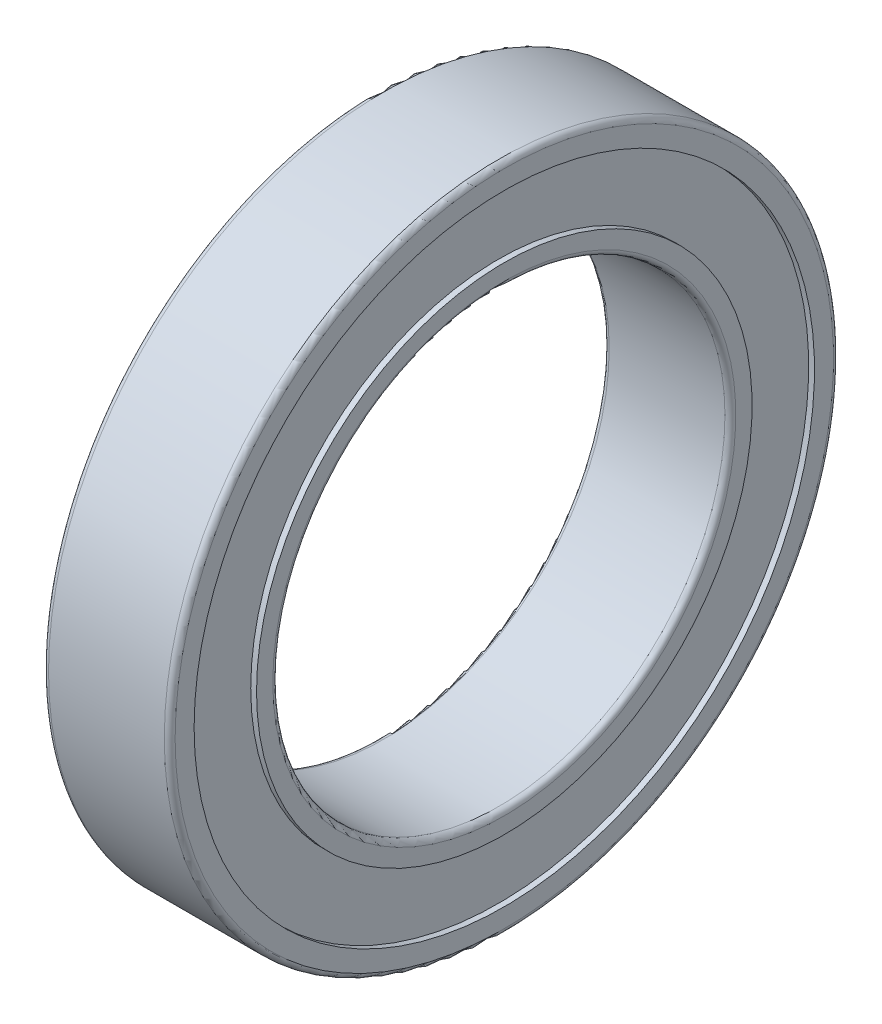
ISO-10303-21;
HEADER;
FILE_DESCRIPTION(('STEP AP214'),'2;1');
FILE_NAME('part.step','',(''),(''),'','','');
FILE_SCHEMA(('AUTOMOTIVE_DESIGN { 1 0 10303 214 1 1 1 1 }'));
ENDSEC;
DATA;
#1=APPLICATION_CONTEXT('core data for automotive mechanical design processes');
#2=APPLICATION_PROTOCOL_DEFINITION('international standard','automotive_design',2000,#1);
#3=PRODUCT_CONTEXT('',#1,'mechanical');
#4=PRODUCT('Part','Part','',(#3));
#5=PRODUCT_RELATED_PRODUCT_CATEGORY('part','',(#4));
#6=PRODUCT_DEFINITION_FORMATION('','',#4);
#7=PRODUCT_DEFINITION_CONTEXT('part definition',#1,'design');
#8=PRODUCT_DEFINITION('design','',#6,#7);
#9=PRODUCT_DEFINITION_SHAPE('','',#8);
#10=(LENGTH_UNIT() NAMED_UNIT(*) SI_UNIT(.MILLI.,.METRE.));
#11=(NAMED_UNIT(*) PLANE_ANGLE_UNIT() SI_UNIT($,.RADIAN.));
#12=(NAMED_UNIT(*) SI_UNIT($,.STERADIAN.) SOLID_ANGLE_UNIT());
#13=UNCERTAINTY_MEASURE_WITH_UNIT(LENGTH_MEASURE(1.E-05),#10,'distance_accuracy_value','');
#14=(GEOMETRIC_REPRESENTATION_CONTEXT(3) GLOBAL_UNCERTAINTY_ASSIGNED_CONTEXT((#13)) GLOBAL_UNIT_ASSIGNED_CONTEXT((#10,
#11,#12)) REPRESENTATION_CONTEXT('',''));
#15=CARTESIAN_POINT('',(0.,0.,0.));
#16=DIRECTION('',(0.,0.,1.));
#17=DIRECTION('',(1.,0.,0.));
#18=AXIS2_PLACEMENT_3D('',#15,#16,#17);
#19=CARTESIAN_POINT('',(0.,18.5,0.));
#20=DIRECTION('',(1.,0.,0.));
#21=DIRECTION('',(0.,0.,-1.));
#22=AXIS2_PLACEMENT_3D('',#19,#20,#21);
#23=PLANE('',#22);
#24=CARTESIAN_POINT('',(0.,0.,0.));
#25=DIRECTION('',(1.,0.,0.));
#26=DIRECTION('',(0.,0.,-1.));
#27=AXIS2_PLACEMENT_3D('',#24,#25,#26);
#28=CIRCLE('',#27,18.2);
#29=CARTESIAN_POINT('',(0.,0.,-18.2));
#30=VERTEX_POINT('',#29);
#31=EDGE_CURVE('E56',#30,#30,#28,.F.);
#32=ORIENTED_EDGE('',*,*,#31,.T.);
#33=EDGE_LOOP('',(#32));
#34=FACE_BOUND('',#33,.T.);
#35=CARTESIAN_POINT('',(0.,0.,0.));
#36=DIRECTION('',(-1.,0.,0.));
#37=DIRECTION('',(0.,0.,1.));
#38=AXIS2_PLACEMENT_3D('',#35,#36,#37);
#39=CIRCLE('',#38,17.15);
#40=CARTESIAN_POINT('',(0.,0.,17.15));
#41=VERTEX_POINT('',#40);
#42=EDGE_CURVE('E68',#41,#41,#39,.T.);
#43=ORIENTED_EDGE('',*,*,#42,.F.);
#44=EDGE_LOOP('',(#43));
#45=FACE_BOUND('',#44,.T.);
#46=ADVANCED_FACE('F36',(#34,#45),#23,.F.);
#47=CARTESIAN_POINT('',(0.,0.,0.));
#48=DIRECTION('',(-1.,0.,0.));
#49=DIRECTION('',(0.,0.,1.));
#50=AXIS2_PLACEMENT_3D('',#47,#48,#49);
#51=CYLINDRICAL_SURFACE('',#50,17.15);
#52=CARTESIAN_POINT('',(0.319999999999999,0.,0.));
#53=DIRECTION('',(-1.,0.,0.));
#54=DIRECTION('',(0.,0.,1.));
#55=AXIS2_PLACEMENT_3D('',#52,#53,#54);
#56=CIRCLE('',#55,17.15);
#57=CARTESIAN_POINT('',(0.319999999999999,0.,17.15));
#58=VERTEX_POINT('',#57);
#59=EDGE_CURVE('E71',#58,#58,#56,.T.);
#60=ORIENTED_EDGE('',*,*,#59,.F.);
#61=EDGE_LOOP('',(#60));
#62=FACE_BOUND('',#61,.T.);
#63=ORIENTED_EDGE('',*,*,#42,.T.);
#64=EDGE_LOOP('',(#63));
#65=FACE_BOUND('',#64,.T.);
#66=ADVANCED_FACE('F124',(#62,#65),#51,.F.);
#67=CARTESIAN_POINT('',(0.319999999999999,17.15,0.));
#68=DIRECTION('',(1.,0.,0.));
#69=DIRECTION('',(0.,0.,-1.));
#70=AXIS2_PLACEMENT_3D('',#67,#68,#69);
#71=PLANE('',#70);
#72=CARTESIAN_POINT('',(0.319999999999999,0.,0.));
#73=DIRECTION('',(-1.,0.,0.));
#74=DIRECTION('',(0.,0.,1.));
#75=AXIS2_PLACEMENT_3D('',#72,#73,#74);
#76=CIRCLE('',#75,13.7);
#77=CARTESIAN_POINT('',(0.319999999999999,0.,13.7));
#78=VERTEX_POINT('',#77);
#79=EDGE_CURVE('E74',#78,#78,#76,.T.);
#80=ORIENTED_EDGE('',*,*,#79,.F.);
#81=EDGE_LOOP('',(#80));
#82=FACE_BOUND('',#81,.T.);
#83=ORIENTED_EDGE('',*,*,#59,.T.);
#84=EDGE_LOOP('',(#83));
#85=FACE_BOUND('',#84,.T.);
#86=ADVANCED_FACE('F130',(#82,#85),#71,.F.);
#87=CARTESIAN_POINT('',(0.,0.,0.));
#88=DIRECTION('',(-1.,0.,0.));
#89=DIRECTION('',(0.,0.,1.));
#90=AXIS2_PLACEMENT_3D('',#87,#88,#89);
#91=CYLINDRICAL_SURFACE('',#90,13.7);
#92=CARTESIAN_POINT('',(0.,0.,0.));
#93=DIRECTION('',(-1.,0.,0.));
#94=DIRECTION('',(0.,0.,1.));
#95=AXIS2_PLACEMENT_3D('',#92,#93,#94);
#96=CIRCLE('',#95,13.7);
#97=CARTESIAN_POINT('',(0.,0.,13.7));
#98=VERTEX_POINT('',#97);
#99=EDGE_CURVE('E77',#98,#98,#96,.T.);
#100=ORIENTED_EDGE('',*,*,#99,.F.);
#101=EDGE_LOOP('',(#100));
#102=FACE_BOUND('',#101,.T.);
#103=ORIENTED_EDGE('',*,*,#79,.T.);
#104=EDGE_LOOP('',(#103));
#105=FACE_BOUND('',#104,.T.);
#106=ADVANCED_FACE('F183',(#102,#105),#91,.T.);
#107=CARTESIAN_POINT('',(0.,13.7,0.));
#108=DIRECTION('',(1.,0.,0.));
#109=DIRECTION('',(0.,0.,-1.));
#110=AXIS2_PLACEMENT_3D('',#107,#108,#109);
#111=PLANE('',#110);
#112=CARTESIAN_POINT('',(0.,0.,0.));
#113=DIRECTION('',(1.,0.,0.));
#114=DIRECTION('',(0.,0.,-1.));
#115=AXIS2_PLACEMENT_3D('',#112,#113,#114);
#116=CIRCLE('',#115,12.8);
#117=CARTESIAN_POINT('',(0.,0.,-12.8));
#118=VERTEX_POINT('',#117);
#119=EDGE_CURVE('E10',#118,#118,#116,.T.);
#120=ORIENTED_EDGE('',*,*,#119,.T.);
#121=EDGE_LOOP('',(#120));
#122=FACE_BOUND('',#121,.T.);
#123=ORIENTED_EDGE('',*,*,#99,.T.);
#124=EDGE_LOOP('',(#123));
#125=FACE_BOUND('',#124,.T.);
#126=ADVANCED_FACE('F121',(#122,#125),#111,.F.);
#127=CARTESIAN_POINT('',(0.,0.,0.));
#128=DIRECTION('',(-1.,0.,0.));
#129=DIRECTION('',(0.,0.,1.));
#130=AXIS2_PLACEMENT_3D('',#127,#128,#129);
#131=CYLINDRICAL_SURFACE('',#130,12.5);
#132=CARTESIAN_POINT('',(6.7,0.,0.));
#133=DIRECTION('',(-1.,0.,0.));
#134=DIRECTION('',(0.,0.,1.));
#135=AXIS2_PLACEMENT_3D('',#132,#133,#134);
#136=CIRCLE('',#135,12.5);
#137=CARTESIAN_POINT('',(6.7,0.,12.5));
#138=VERTEX_POINT('',#137);
#139=EDGE_CURVE('E43',#138,#138,#136,.F.);
#140=ORIENTED_EDGE('',*,*,#139,.T.);
#141=EDGE_LOOP('',(#140));
#142=FACE_BOUND('',#141,.T.);
#143=CARTESIAN_POINT('',(0.299999999999999,0.,0.));
#144=DIRECTION('',(1.,0.,0.));
#145=DIRECTION('',(0.,0.,-1.));
#146=AXIS2_PLACEMENT_3D('',#143,#144,#145);
#147=CIRCLE('',#146,12.5);
#148=CARTESIAN_POINT('',(0.299999999999999,0.,-12.5));
#149=VERTEX_POINT('',#148);
#150=EDGE_CURVE('E47',#149,#149,#147,.F.);
#151=ORIENTED_EDGE('',*,*,#150,.T.);
#152=EDGE_LOOP('',(#151));
#153=FACE_BOUND('',#152,.T.);
#154=ADVANCED_FACE('F115',(#142,#153),#131,.F.);
#155=CARTESIAN_POINT('',(7.,13.7,0.));
#156=DIRECTION('',(-1.,0.,0.));
#157=DIRECTION('',(0.,0.,1.));
#158=AXIS2_PLACEMENT_3D('',#155,#156,#157);
#159=PLANE('',#158);
#160=CARTESIAN_POINT('',(7.,0.,0.));
#161=DIRECTION('',(-1.,0.,0.));
#162=DIRECTION('',(0.,0.,1.));
#163=AXIS2_PLACEMENT_3D('',#160,#161,#162);
#164=CIRCLE('',#163,12.8);
#165=CARTESIAN_POINT('',(7.,0.,12.8));
#166=VERTEX_POINT('',#165);
#167=EDGE_CURVE('E51',#166,#166,#164,.T.);
#168=ORIENTED_EDGE('',*,*,#167,.T.);
#169=EDGE_LOOP('',(#168));
#170=FACE_BOUND('',#169,.T.);
#171=CARTESIAN_POINT('',(7.,0.,0.));
#172=DIRECTION('',(-1.,0.,0.));
#173=DIRECTION('',(0.,0.,1.));
#174=AXIS2_PLACEMENT_3D('',#171,#172,#173);
#175=CIRCLE('',#174,13.7);
#176=CARTESIAN_POINT('',(7.,0.,13.7));
#177=VERTEX_POINT('',#176);
#178=EDGE_CURVE('E80',#177,#177,#175,.T.);
#179=ORIENTED_EDGE('',*,*,#178,.F.);
#180=EDGE_LOOP('',(#179));
#181=FACE_BOUND('',#180,.T.);
#182=ADVANCED_FACE('F110',(#170,#181),#159,.F.);
#183=CARTESIAN_POINT('',(0.,0.,0.));
#184=DIRECTION('',(-1.,0.,0.));
#185=DIRECTION('',(0.,0.,1.));
#186=AXIS2_PLACEMENT_3D('',#183,#184,#185);
#187=CYLINDRICAL_SURFACE('',#186,13.7);
#188=CARTESIAN_POINT('',(6.68,0.,0.));
#189=DIRECTION('',(-1.,0.,0.));
#190=DIRECTION('',(0.,0.,1.));
#191=AXIS2_PLACEMENT_3D('',#188,#189,#190);
#192=CIRCLE('',#191,13.7);
#193=CARTESIAN_POINT('',(6.68,0.,13.7));
#194=VERTEX_POINT('',#193);
#195=EDGE_CURVE('E83',#194,#194,#192,.T.);
#196=ORIENTED_EDGE('',*,*,#195,.F.);
#197=EDGE_LOOP('',(#196));
#198=FACE_BOUND('',#197,.T.);
#199=ORIENTED_EDGE('',*,*,#178,.T.);
#200=EDGE_LOOP('',(#199));
#201=FACE_BOUND('',#200,.T.);
#202=ADVANCED_FACE('F104',(#198,#201),#187,.T.);
#203=CARTESIAN_POINT('',(6.68,17.15,0.));
#204=DIRECTION('',(-1.,0.,0.));
#205=DIRECTION('',(0.,0.,1.));
#206=AXIS2_PLACEMENT_3D('',#203,#204,#205);
#207=PLANE('',#206);
#208=CARTESIAN_POINT('',(6.68,0.,0.));
#209=DIRECTION('',(-1.,0.,0.));
#210=DIRECTION('',(0.,0.,1.));
#211=AXIS2_PLACEMENT_3D('',#208,#209,#210);
#212=CIRCLE('',#211,17.15);
#213=CARTESIAN_POINT('',(6.68,0.,17.15));
#214=VERTEX_POINT('',#213);
#215=EDGE_CURVE('E86',#214,#214,#212,.T.);
#216=ORIENTED_EDGE('',*,*,#215,.F.);
#217=EDGE_LOOP('',(#216));
#218=FACE_BOUND('',#217,.T.);
#219=ORIENTED_EDGE('',*,*,#195,.T.);
#220=EDGE_LOOP('',(#219));
#221=FACE_BOUND('',#220,.T.);
#222=ADVANCED_FACE('F98',(#218,#221),#207,.F.);
#223=CARTESIAN_POINT('',(0.,0.,0.));
#224=DIRECTION('',(-1.,0.,0.));
#225=DIRECTION('',(0.,0.,1.));
#226=AXIS2_PLACEMENT_3D('',#223,#224,#225);
#227=CYLINDRICAL_SURFACE('',#226,17.15);
#228=CARTESIAN_POINT('',(7.,0.,0.));
#229=DIRECTION('',(-1.,0.,0.));
#230=DIRECTION('',(0.,0.,1.));
#231=AXIS2_PLACEMENT_3D('',#228,#229,#230);
#232=CIRCLE('',#231,17.15);
#233=CARTESIAN_POINT('',(7.,0.,17.15));
#234=VERTEX_POINT('',#233);
#235=EDGE_CURVE('E89',#234,#234,#232,.T.);
#236=ORIENTED_EDGE('',*,*,#235,.F.);
#237=EDGE_LOOP('',(#236));
#238=FACE_BOUND('',#237,.T.);
#239=ORIENTED_EDGE('',*,*,#215,.T.);
#240=EDGE_LOOP('',(#239));
#241=FACE_BOUND('',#240,.T.);
#242=ADVANCED_FACE('F95',(#238,#241),#227,.F.);
#243=CARTESIAN_POINT('',(7.,18.5,0.));
#244=DIRECTION('',(-1.,0.,0.));
#245=DIRECTION('',(0.,0.,1.));
#246=AXIS2_PLACEMENT_3D('',#243,#244,#245);
#247=PLANE('',#246);
#248=CARTESIAN_POINT('',(7.,0.,0.));
#249=DIRECTION('',(-1.,0.,0.));
#250=DIRECTION('',(0.,0.,1.));
#251=AXIS2_PLACEMENT_3D('',#248,#249,#250);
#252=CIRCLE('',#251,18.2);
#253=CARTESIAN_POINT('',(7.,0.,18.2));
#254=VERTEX_POINT('',#253);
#255=EDGE_CURVE('E59',#254,#254,#252,.F.);
#256=ORIENTED_EDGE('',*,*,#255,.T.);
#257=EDGE_LOOP('',(#256));
#258=FACE_BOUND('',#257,.T.);
#259=ORIENTED_EDGE('',*,*,#235,.T.);
#260=EDGE_LOOP('',(#259));
#261=FACE_BOUND('',#260,.T.);
#262=ADVANCED_FACE('F93',(#258,#261),#247,.F.);
#263=CARTESIAN_POINT('',(0.,0.,0.));
#264=DIRECTION('',(-1.,0.,0.));
#265=DIRECTION('',(0.,0.,1.));
#266=AXIS2_PLACEMENT_3D('',#263,#264,#265);
#267=CYLINDRICAL_SURFACE('',#266,18.5);
#268=CARTESIAN_POINT('',(6.7,0.,0.));
#269=DIRECTION('',(-1.,0.,0.));
#270=DIRECTION('',(0.,0.,1.));
#271=AXIS2_PLACEMENT_3D('',#268,#269,#270);
#272=CIRCLE('',#271,18.5);
#273=CARTESIAN_POINT('',(6.7,0.,18.5));
#274=VERTEX_POINT('',#273);
#275=EDGE_CURVE('E62',#274,#274,#272,.T.);
#276=ORIENTED_EDGE('',*,*,#275,.T.);
#277=EDGE_LOOP('',(#276));
#278=FACE_BOUND('',#277,.T.);
#279=CARTESIAN_POINT('',(0.299999999999999,0.,0.));
#280=DIRECTION('',(1.,0.,0.));
#281=DIRECTION('',(0.,0.,-1.));
#282=AXIS2_PLACEMENT_3D('',#279,#280,#281);
#283=CIRCLE('',#282,18.5);
#284=CARTESIAN_POINT('',(0.299999999999999,0.,-18.5));
#285=VERTEX_POINT('',#284);
#286=EDGE_CURVE('E65',#285,#285,#283,.T.);
#287=ORIENTED_EDGE('',*,*,#286,.T.);
#288=EDGE_LOOP('',(#287));
#289=FACE_BOUND('',#288,.T.);
#290=ADVANCED_FACE('F140',(#278,#289),#267,.T.);
#291=CARTESIAN_POINT('',(6.7,0.,0.));
#292=DIRECTION('',(-1.,0.,0.));
#293=DIRECTION('',(0.,0.,1.));
#294=AXIS2_PLACEMENT_3D('',#291,#292,#293);
#295=TOROIDAL_SURFACE('',#294,18.2,0.3);
#296=ORIENTED_EDGE('',*,*,#255,.F.);
#297=EDGE_LOOP('',(#296));
#298=FACE_BOUND('',#297,.T.);
#299=ORIENTED_EDGE('',*,*,#275,.F.);
#300=EDGE_LOOP('',(#299));
#301=FACE_BOUND('',#300,.T.);
#302=ADVANCED_FACE('F136',(#298,#301),#295,.T.);
#303=CARTESIAN_POINT('',(0.299999999999999,0.,0.));
#304=DIRECTION('',(1.,0.,0.));
#305=DIRECTION('',(0.,0.,-1.));
#306=AXIS2_PLACEMENT_3D('',#303,#304,#305);
#307=TOROIDAL_SURFACE('',#306,18.2,0.3);
#308=ORIENTED_EDGE('',*,*,#286,.F.);
#309=EDGE_LOOP('',(#308));
#310=FACE_BOUND('',#309,.T.);
#311=ORIENTED_EDGE('',*,*,#31,.F.);
#312=EDGE_LOOP('',(#311));
#313=FACE_BOUND('',#312,.T.);
#314=ADVANCED_FACE('F139',(#310,#313),#307,.T.);
#315=CARTESIAN_POINT('',(6.7,0.,0.));
#316=DIRECTION('',(-1.,0.,0.));
#317=DIRECTION('',(0.,0.,1.));
#318=AXIS2_PLACEMENT_3D('',#315,#316,#317);
#319=TOROIDAL_SURFACE('',#318,12.8,0.3);
#320=ORIENTED_EDGE('',*,*,#139,.F.);
#321=EDGE_LOOP('',(#320));
#322=FACE_BOUND('',#321,.T.);
#323=ORIENTED_EDGE('',*,*,#167,.F.);
#324=EDGE_LOOP('',(#323));
#325=FACE_BOUND('',#324,.T.);
#326=ADVANCED_FACE('F143',(#322,#325),#319,.T.);
#327=CARTESIAN_POINT('',(0.299999999999999,0.,0.));
#328=DIRECTION('',(1.,0.,0.));
#329=DIRECTION('',(0.,0.,-1.));
#330=AXIS2_PLACEMENT_3D('',#327,#328,#329);
#331=TOROIDAL_SURFACE('',#330,12.8,0.3);
#332=ORIENTED_EDGE('',*,*,#119,.F.);
#333=EDGE_LOOP('',(#332));
#334=FACE_BOUND('',#333,.T.);
#335=ORIENTED_EDGE('',*,*,#150,.F.);
#336=EDGE_LOOP('',(#335));
#337=FACE_BOUND('',#336,.T.);
#338=ADVANCED_FACE('F38',(#334,#337),#331,.T.);
#339=CLOSED_SHELL('',(#46,#66,#86,#106,#126,#154,#182,#202,#222,#242,#262,#290,#302,#314,#326,#338));
#340=MANIFOLD_SOLID_BREP('B2',#339);
#341=ADVANCED_BREP_SHAPE_REPRESENTATION('',(#18,#340),#14);
#342=SHAPE_DEFINITION_REPRESENTATION(#9,#341);
ENDSEC;
END-ISO-10303-21;
